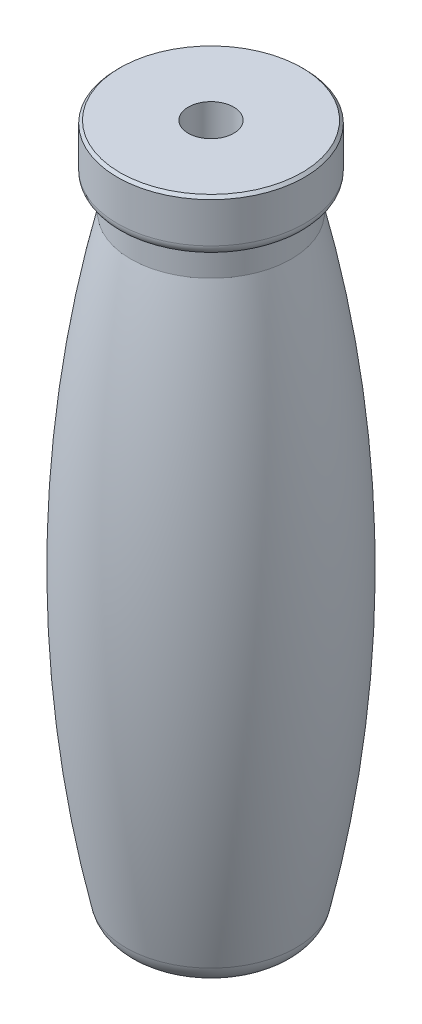
ISO-10303-21;
HEADER;
FILE_DESCRIPTION(('STEP AP214'),'2;1');
FILE_NAME('part.step','',(''),(''),'','','');
FILE_SCHEMA(('AUTOMOTIVE_DESIGN { 1 0 10303 214 1 1 1 1 }'));
ENDSEC;
DATA;
#1=APPLICATION_CONTEXT('core data for automotive mechanical design processes');
#2=APPLICATION_PROTOCOL_DEFINITION('international standard','automotive_design',2000,#1);
#3=PRODUCT_CONTEXT('',#1,'mechanical');
#4=PRODUCT('Part','Part','',(#3));
#5=PRODUCT_RELATED_PRODUCT_CATEGORY('part','',(#4));
#6=PRODUCT_DEFINITION_FORMATION('','',#4);
#7=PRODUCT_DEFINITION_CONTEXT('part definition',#1,'design');
#8=PRODUCT_DEFINITION('design','',#6,#7);
#9=PRODUCT_DEFINITION_SHAPE('','',#8);
#10=(LENGTH_UNIT() NAMED_UNIT(*) SI_UNIT(.MILLI.,.METRE.));
#11=(NAMED_UNIT(*) PLANE_ANGLE_UNIT() SI_UNIT($,.RADIAN.));
#12=(NAMED_UNIT(*) SI_UNIT($,.STERADIAN.) SOLID_ANGLE_UNIT());
#13=UNCERTAINTY_MEASURE_WITH_UNIT(LENGTH_MEASURE(1.E-05),#10,'distance_accuracy_value','');
#14=(GEOMETRIC_REPRESENTATION_CONTEXT(3) GLOBAL_UNCERTAINTY_ASSIGNED_CONTEXT((#13)) GLOBAL_UNIT_ASSIGNED_CONTEXT((#10,
#11,#12)) REPRESENTATION_CONTEXT('',''));
#15=CARTESIAN_POINT('',(0.,0.,0.));
#16=DIRECTION('',(0.,0.,1.));
#17=DIRECTION('',(1.,0.,0.));
#18=AXIS2_PLACEMENT_3D('',#15,#16,#17);
#19=CARTESIAN_POINT('',(0.,10.,0.));
#20=DIRECTION('',(0.,-1.,0.));
#21=DIRECTION('',(0.,0.,-1.));
#22=AXIS2_PLACEMENT_3D('',#19,#20,#21);
#23=CYLINDRICAL_SURFACE('',#22,17.5);
#24=CARTESIAN_POINT('',(0.,9.49999999999997,0.));
#25=DIRECTION('',(0.,1.,0.));
#26=DIRECTION('',(0.,0.,1.));
#27=AXIS2_PLACEMENT_3D('',#24,#25,#26);
#28=CIRCLE('',#27,17.5);
#29=CARTESIAN_POINT('',(0.,9.49999999999997,17.5));
#30=VERTEX_POINT('',#29);
#31=EDGE_CURVE('E10',#30,#30,#28,.F.);
#32=ORIENTED_EDGE('',*,*,#31,.T.);
#33=EDGE_LOOP('',(#32));
#34=FACE_BOUND('',#33,.T.);
#35=CARTESIAN_POINT('',(0.,2.,0.));
#36=DIRECTION('',(0.,1.,0.));
#37=DIRECTION('',(0.,0.,1.));
#38=AXIS2_PLACEMENT_3D('',#35,#36,#37);
#39=CIRCLE('',#38,17.5);
#40=CARTESIAN_POINT('',(0.,2.,17.5));
#41=VERTEX_POINT('',#40);
#42=EDGE_CURVE('E55',#41,#41,#39,.T.);
#43=ORIENTED_EDGE('',*,*,#42,.T.);
#44=EDGE_LOOP('',(#43));
#45=FACE_BOUND('',#44,.T.);
#46=ADVANCED_FACE('F39',(#34,#45),#23,.T.);
#47=CARTESIAN_POINT('',(0.,10.,0.));
#48=DIRECTION('',(0.,1.,0.));
#49=DIRECTION('',(0.,0.,1.));
#50=AXIS2_PLACEMENT_3D('',#47,#48,#49);
#51=PLANE('',#50);
#52=CARTESIAN_POINT('',(0.,10.,0.));
#53=DIRECTION('',(0.,1.,0.));
#54=DIRECTION('',(0.,0.,1.));
#55=AXIS2_PLACEMENT_3D('',#52,#53,#54);
#56=CIRCLE('',#55,17.);
#57=CARTESIAN_POINT('',(0.,10.,17.));
#58=VERTEX_POINT('',#57);
#59=EDGE_CURVE('E47',#58,#58,#56,.T.);
#60=ORIENTED_EDGE('',*,*,#59,.T.);
#61=EDGE_LOOP('',(#60));
#62=FACE_BOUND('',#61,.T.);
#63=CARTESIAN_POINT('',(0.,10.,0.));
#64=DIRECTION('',(0.,1.,0.));
#65=DIRECTION('',(0.,0.,1.));
#66=AXIS2_PLACEMENT_3D('',#63,#64,#65);
#67=CIRCLE('',#66,4.25);
#68=CARTESIAN_POINT('',(0.,10.,4.25));
#69=VERTEX_POINT('',#68);
#70=EDGE_CURVE('E79',#69,#69,#67,.T.);
#71=ORIENTED_EDGE('',*,*,#70,.F.);
#72=EDGE_LOOP('',(#71));
#73=FACE_BOUND('',#72,.T.);
#74=ADVANCED_FACE('F95',(#62,#73),#51,.T.);
#75=CARTESIAN_POINT('',(0.,0.,0.));
#76=DIRECTION('',(0.,1.,0.));
#77=DIRECTION('',(0.,0.,1.));
#78=AXIS2_PLACEMENT_3D('',#75,#76,#77);
#79=PLANE('',#78);
#80=CARTESIAN_POINT('',(0.,0.,0.));
#81=DIRECTION('',(0.,1.,0.));
#82=DIRECTION('',(0.,0.,1.));
#83=AXIS2_PLACEMENT_3D('',#80,#81,#82);
#84=CIRCLE('',#83,15.5);
#85=CARTESIAN_POINT('',(0.,0.,15.5));
#86=VERTEX_POINT('',#85);
#87=EDGE_CURVE('E51',#86,#86,#84,.F.);
#88=ORIENTED_EDGE('',*,*,#87,.T.);
#89=EDGE_LOOP('',(#88));
#90=FACE_BOUND('',#89,.T.);
#91=CARTESIAN_POINT('',(0.,0.,0.));
#92=DIRECTION('',(0.,1.,0.));
#93=DIRECTION('',(0.,0.,1.));
#94=AXIS2_PLACEMENT_3D('',#91,#92,#93);
#95=CIRCLE('',#94,15.);
#96=CARTESIAN_POINT('',(0.,0.,15.));
#97=VERTEX_POINT('',#96);
#98=EDGE_CURVE('E69',#97,#97,#95,.T.);
#99=ORIENTED_EDGE('',*,*,#98,.T.);
#100=EDGE_LOOP('',(#99));
#101=FACE_BOUND('',#100,.T.);
#102=ADVANCED_FACE('F97',(#90,#101),#79,.F.);
#103=CARTESIAN_POINT('',(0.,-120.,0.));
#104=DIRECTION('',(0.,1.,0.));
#105=DIRECTION('',(0.,0.,1.));
#106=AXIS2_PLACEMENT_3D('',#103,#104,#105);
#107=PLANE('',#106);
#108=CARTESIAN_POINT('',(0.,-120.,0.));
#109=DIRECTION('',(0.,-1.,0.));
#110=DIRECTION('',(0.,0.,-1.));
#111=AXIS2_PLACEMENT_3D('',#108,#109,#110);
#112=CIRCLE('',#111,7.5);
#113=CARTESIAN_POINT('',(0.,-120.,-7.50000000000001));
#114=VERTEX_POINT('',#113);
#115=EDGE_CURVE('E73',#114,#114,#112,.T.);
#116=ORIENTED_EDGE('',*,*,#115,.F.);
#117=EDGE_LOOP('',(#116));
#118=FACE_BOUND('',#117,.T.);
#119=CARTESIAN_POINT('',(0.,-120.,0.));
#120=DIRECTION('',(0.,1.,0.));
#121=DIRECTION('',(0.,0.,1.));
#122=AXIS2_PLACEMENT_3D('',#119,#120,#121);
#123=CIRCLE('',#122,11.0112435935663);
#124=CARTESIAN_POINT('',(0.,-120.,11.0112435935663));
#125=VERTEX_POINT('',#124);
#126=EDGE_CURVE('E60',#125,#125,#123,.F.);
#127=ORIENTED_EDGE('',*,*,#126,.T.);
#128=EDGE_LOOP('',(#127));
#129=FACE_BOUND('',#128,.T.);
#130=ADVANCED_FACE('F104',(#118,#129),#107,.F.);
#131=CARTESIAN_POINT('',(0.,-62.5,0.));
#132=DIRECTION('',(0.,1.,0.));
#133=DIRECTION('',(0.,0.,1.));
#134=AXIS2_PLACEMENT_3D('',#131,#132,#133);
#135=DEGENERATE_TOROIDAL_SURFACE('',#134,228.297657202037,250.,.F.);
#136=CARTESIAN_POINT('',(0.,-116.071428571429,0.));
#137=DIRECTION('',(0.,1.,0.));
#138=DIRECTION('',(0.,0.,1.));
#139=AXIS2_PLACEMENT_3D('',#136,#137,#138);
#140=CIRCLE('',#139,15.8950987118439);
#141=CARTESIAN_POINT('',(0.,-116.071428571429,15.8950987118439));
#142=VERTEX_POINT('',#141);
#143=EDGE_CURVE('E63',#142,#142,#140,.T.);
#144=ORIENTED_EDGE('',*,*,#143,.T.);
#145=EDGE_LOOP('',(#144));
#146=FACE_BOUND('',#145,.T.);
#147=CARTESIAN_POINT('',(0.,-5.,0.));
#148=DIRECTION('',(0.,1.,0.));
#149=DIRECTION('',(0.,0.,1.));
#150=AXIS2_PLACEMENT_3D('',#147,#148,#149);
#151=CIRCLE('',#150,15.);
#152=CARTESIAN_POINT('',(0.,-5.,15.));
#153=VERTEX_POINT('',#152);
#154=EDGE_CURVE('E66',#153,#153,#151,.T.);
#155=ORIENTED_EDGE('',*,*,#154,.F.);
#156=EDGE_LOOP('',(#155));
#157=FACE_BOUND('',#156,.T.);
#158=ADVANCED_FACE('F130',(#146,#157),#135,.F.);
#159=CARTESIAN_POINT('',(0.,0.,0.));
#160=DIRECTION('',(0.,1.,0.));
#161=DIRECTION('',(0.,0.,1.));
#162=AXIS2_PLACEMENT_3D('',#159,#160,#161);
#163=CYLINDRICAL_SURFACE('',#162,15.);
#164=ORIENTED_EDGE('',*,*,#98,.F.);
#165=EDGE_LOOP('',(#164));
#166=FACE_BOUND('',#165,.T.);
#167=ORIENTED_EDGE('',*,*,#154,.T.);
#168=EDGE_LOOP('',(#167));
#169=FACE_BOUND('',#168,.T.);
#170=ADVANCED_FACE('F114',(#166,#169),#163,.T.);
#171=CARTESIAN_POINT('',(0.,-115.,0.));
#172=DIRECTION('',(0.,1.,0.));
#173=DIRECTION('',(0.,0.,1.));
#174=AXIS2_PLACEMENT_3D('',#171,#172,#173);
#175=TOROIDAL_SURFACE('',#174,11.0112435935663,5.);
#176=ORIENTED_EDGE('',*,*,#126,.F.);
#177=EDGE_LOOP('',(#176));
#178=FACE_BOUND('',#177,.T.);
#179=ORIENTED_EDGE('',*,*,#143,.F.);
#180=EDGE_LOOP('',(#179));
#181=FACE_BOUND('',#180,.T.);
#182=ADVANCED_FACE('F111',(#178,#181),#175,.T.);
#183=CARTESIAN_POINT('',(0.,-10.0000000000001,0.));
#184=DIRECTION('',(0.,-1.,0.));
#185=DIRECTION('',(0.,0.,-1.));
#186=AXIS2_PLACEMENT_3D('',#183,#184,#185);
#187=CYLINDRICAL_SURFACE('',#186,7.5);
#188=CARTESIAN_POINT('',(0.,-10.0000000000001,0.));
#189=DIRECTION('',(0.,-1.,0.));
#190=DIRECTION('',(0.,0.,-1.));
#191=AXIS2_PLACEMENT_3D('',#188,#189,#190);
#192=CIRCLE('',#191,7.5);
#193=CARTESIAN_POINT('',(0.,-10.0000000000001,-7.5));
#194=VERTEX_POINT('',#193);
#195=EDGE_CURVE('E72',#194,#194,#192,.T.);
#196=ORIENTED_EDGE('',*,*,#195,.F.);
#197=EDGE_LOOP('',(#196));
#198=FACE_BOUND('',#197,.T.);
#199=ORIENTED_EDGE('',*,*,#115,.T.);
#200=EDGE_LOOP('',(#199));
#201=FACE_BOUND('',#200,.T.);
#202=ADVANCED_FACE('F113',(#198,#201),#187,.F.);
#203=CARTESIAN_POINT('',(0.,-10.0000000000001,0.));
#204=DIRECTION('',(0.,-1.,0.));
#205=DIRECTION('',(0.,0.,-1.));
#206=AXIS2_PLACEMENT_3D('',#203,#204,#205);
#207=PLANE('',#206);
#208=CARTESIAN_POINT('',(0.,-10.,0.));
#209=DIRECTION('',(0.,1.,0.));
#210=DIRECTION('',(0.,0.,1.));
#211=AXIS2_PLACEMENT_3D('',#208,#209,#210);
#212=CIRCLE('',#211,4.25);
#213=CARTESIAN_POINT('',(0.,-10.,4.25));
#214=VERTEX_POINT('',#213);
#215=EDGE_CURVE('E76',#214,#214,#212,.T.);
#216=ORIENTED_EDGE('',*,*,#215,.T.);
#217=EDGE_LOOP('',(#216));
#218=FACE_BOUND('',#217,.T.);
#219=ORIENTED_EDGE('',*,*,#195,.T.);
#220=EDGE_LOOP('',(#219));
#221=FACE_BOUND('',#220,.T.);
#222=ADVANCED_FACE('F85',(#218,#221),#207,.T.);
#223=CARTESIAN_POINT('',(0.,-10.,0.));
#224=DIRECTION('',(0.,1.,0.));
#225=DIRECTION('',(0.,0.,1.));
#226=AXIS2_PLACEMENT_3D('',#223,#224,#225);
#227=CYLINDRICAL_SURFACE('',#226,4.25);
#228=ORIENTED_EDGE('',*,*,#215,.F.);
#229=EDGE_LOOP('',(#228));
#230=FACE_BOUND('',#229,.T.);
#231=ORIENTED_EDGE('',*,*,#70,.T.);
#232=EDGE_LOOP('',(#231));
#233=FACE_BOUND('',#232,.T.);
#234=ADVANCED_FACE('F88',(#230,#233),#227,.F.);
#235=CARTESIAN_POINT('',(0.,2.,0.));
#236=DIRECTION('',(0.,1.,0.));
#237=DIRECTION('',(0.,0.,1.));
#238=AXIS2_PLACEMENT_3D('',#235,#236,#237);
#239=TOROIDAL_SURFACE('',#238,15.5,2.);
#240=ORIENTED_EDGE('',*,*,#87,.F.);
#241=EDGE_LOOP('',(#240));
#242=FACE_BOUND('',#241,.T.);
#243=ORIENTED_EDGE('',*,*,#42,.F.);
#244=EDGE_LOOP('',(#243));
#245=FACE_BOUND('',#244,.T.);
#246=ADVANCED_FACE('F91',(#242,#245),#239,.T.);
#247=CARTESIAN_POINT('',(0.,10.,0.));
#248=DIRECTION('',(0.,-1.,0.));
#249=DIRECTION('',(0.,0.,-1.));
#250=AXIS2_PLACEMENT_3D('',#247,#248,#249);
#251=CONICAL_SURFACE('',#250,17.,0.785398163397434);
#252=ORIENTED_EDGE('',*,*,#31,.F.);
#253=EDGE_LOOP('',(#252));
#254=FACE_BOUND('',#253,.T.);
#255=ORIENTED_EDGE('',*,*,#59,.F.);
#256=EDGE_LOOP('',(#255));
#257=FACE_BOUND('',#256,.T.);
#258=ADVANCED_FACE('F42',(#254,#257),#251,.T.);
#259=CLOSED_SHELL('',(#46,#74,#102,#130,#158,#170,#182,#202,#222,#234,#246,#258));
#260=MANIFOLD_SOLID_BREP('B2',#259);
#261=ADVANCED_BREP_SHAPE_REPRESENTATION('',(#18,#260),#14);
#262=SHAPE_DEFINITION_REPRESENTATION(#9,#261);
ENDSEC;
END-ISO-10303-21;
